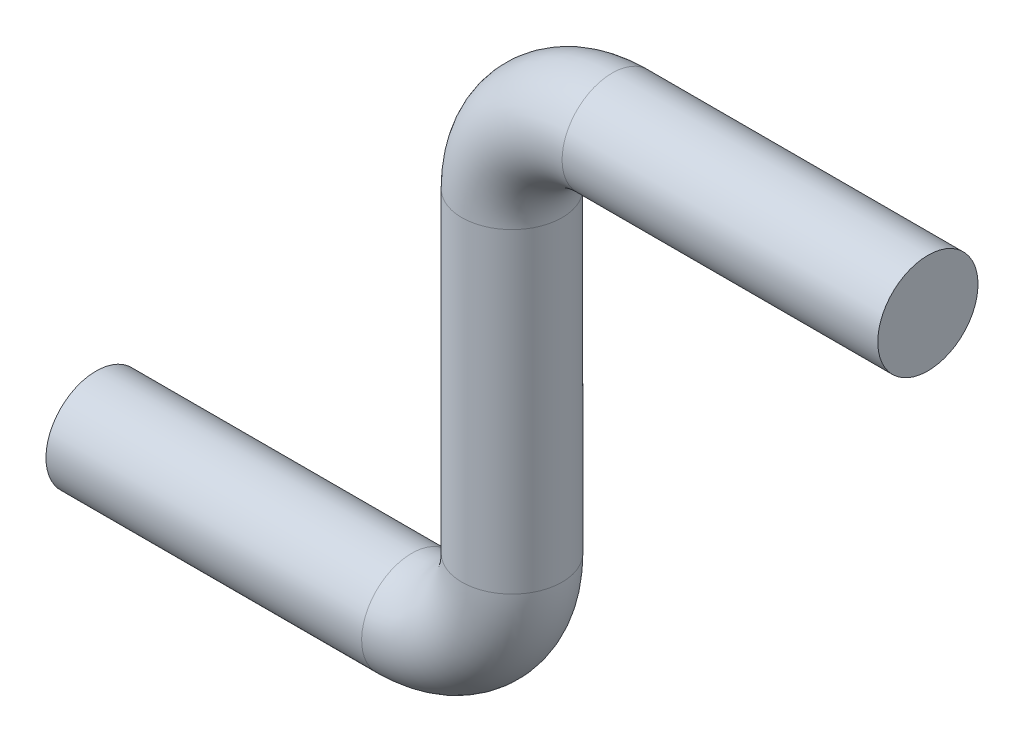
ISO-10303-21;
HEADER;
FILE_DESCRIPTION(('STEP AP214'),'2;1');
FILE_NAME('part.step','',(''),(''),'','','');
FILE_SCHEMA(('AUTOMOTIVE_DESIGN { 1 0 10303 214 1 1 1 1 }'));
ENDSEC;
DATA;
#1=APPLICATION_CONTEXT('core data for automotive mechanical design processes');
#2=APPLICATION_PROTOCOL_DEFINITION('international standard','automotive_design',2000,#1);
#3=PRODUCT_CONTEXT('',#1,'mechanical');
#4=PRODUCT('Part','Part','',(#3));
#5=PRODUCT_RELATED_PRODUCT_CATEGORY('part','',(#4));
#6=PRODUCT_DEFINITION_FORMATION('','',#4);
#7=PRODUCT_DEFINITION_CONTEXT('part definition',#1,'design');
#8=PRODUCT_DEFINITION('design','',#6,#7);
#9=PRODUCT_DEFINITION_SHAPE('','',#8);
#10=(LENGTH_UNIT() NAMED_UNIT(*) SI_UNIT(.MILLI.,.METRE.));
#11=(NAMED_UNIT(*) PLANE_ANGLE_UNIT() SI_UNIT($,.RADIAN.));
#12=(NAMED_UNIT(*) SI_UNIT($,.STERADIAN.) SOLID_ANGLE_UNIT());
#13=UNCERTAINTY_MEASURE_WITH_UNIT(LENGTH_MEASURE(1.E-05),#10,'distance_accuracy_value','');
#14=(GEOMETRIC_REPRESENTATION_CONTEXT(3) GLOBAL_UNCERTAINTY_ASSIGNED_CONTEXT((#13)) GLOBAL_UNIT_ASSIGNED_CONTEXT((#10,
#11,#12)) REPRESENTATION_CONTEXT('',''));
#15=CARTESIAN_POINT('',(0.,0.,0.));
#16=DIRECTION('',(0.,0.,1.));
#17=DIRECTION('',(1.,0.,0.));
#18=AXIS2_PLACEMENT_3D('',#15,#16,#17);
#19=CARTESIAN_POINT('',(8.175,8.175,0.));
#20=DIRECTION('',(1.,0.,0.));
#21=DIRECTION('',(0.,1.,0.));
#22=AXIS2_PLACEMENT_3D('',#19,#20,#21);
#23=CYLINDRICAL_SURFACE('',#22,0.79375);
#24=CARTESIAN_POINT('',(8.175,8.175,0.));
#25=DIRECTION('',(1.,0.,0.));
#26=DIRECTION('',(0.,0.,-1.));
#27=AXIS2_PLACEMENT_3D('',#24,#25,#26);
#28=CIRCLE('',#27,0.79375);
#29=CARTESIAN_POINT('',(8.175,8.96875,0.));
#30=VERTEX_POINT('',#29);
#31=EDGE_CURVE('E38',#30,#30,#28,.T.);
#32=ORIENTED_EDGE('',*,*,#31,.T.);
#33=EDGE_LOOP('',(#32));
#34=FACE_BOUND('',#33,.T.);
#35=CARTESIAN_POINT('',(13.175,8.175,0.));
#36=DIRECTION('',(1.,0.,0.));
#37=DIRECTION('',(0.,0.,-1.));
#38=AXIS2_PLACEMENT_3D('',#35,#36,#37);
#39=CIRCLE('',#38,0.79375);
#40=CARTESIAN_POINT('',(13.175,8.175,-0.79375));
#41=VERTEX_POINT('',#40);
#42=EDGE_CURVE('E10',#41,#41,#39,.T.);
#43=ORIENTED_EDGE('',*,*,#42,.F.);
#44=EDGE_LOOP('',(#43));
#45=FACE_BOUND('',#44,.T.);
#46=ADVANCED_FACE('F32',(#34,#45),#23,.T.);
#47=CARTESIAN_POINT('',(8.175,6.5875,0.));
#48=DIRECTION('',(0.,0.,-1.));
#49=DIRECTION('',(-1.,0.,0.));
#50=AXIS2_PLACEMENT_3D('',#47,#48,#49);
#51=TOROIDAL_SURFACE('',#50,1.5875,0.79375);
#52=CARTESIAN_POINT('',(6.5875,6.5875,0.));
#53=DIRECTION('',(0.,1.,0.));
#54=DIRECTION('',(0.,0.,-1.));
#55=AXIS2_PLACEMENT_3D('',#52,#53,#54);
#56=CIRCLE('',#55,0.79375);
#57=CARTESIAN_POINT('',(5.79375,6.5875,0.));
#58=VERTEX_POINT('',#57);
#59=EDGE_CURVE('E42',#58,#58,#56,.T.);
#60=CARTESIAN_POINT('',(8.175,6.5875,0.));
#61=DIRECTION('',(0.,0.,-1.));
#62=DIRECTION('',(-1.,0.,0.));
#63=AXIS2_PLACEMENT_3D('',#60,#61,#62);
#64=CIRCLE('',#63,2.38125);
#65=EDGE_CURVE('',#58,#30,#64,.T.);
#66=ORIENTED_EDGE('',*,*,#59,.T.);
#67=ORIENTED_EDGE('',*,*,#31,.F.);
#68=ORIENTED_EDGE('',*,*,#65,.T.);
#69=ORIENTED_EDGE('',*,*,#65,.F.);
#70=EDGE_LOOP('',(#66,#68,#67,#69));
#71=FACE_BOUND('',#70,.T.);
#72=ADVANCED_FACE('F76',(#71),#51,.T.);
#73=CARTESIAN_POINT('',(6.5875,1.5875,0.));
#74=DIRECTION('',(0.,1.,0.));
#75=DIRECTION('',(0.,0.,1.));
#76=AXIS2_PLACEMENT_3D('',#73,#74,#75);
#77=CYLINDRICAL_SURFACE('',#76,0.79375);
#78=CARTESIAN_POINT('',(6.5875,1.5875,0.));
#79=DIRECTION('',(0.,1.,0.));
#80=DIRECTION('',(0.,0.,-1.));
#81=AXIS2_PLACEMENT_3D('',#78,#79,#80);
#82=CIRCLE('',#81,0.79375);
#83=CARTESIAN_POINT('',(7.38125,1.5875,0.));
#84=VERTEX_POINT('',#83);
#85=EDGE_CURVE('E46',#84,#84,#82,.T.);
#86=ORIENTED_EDGE('',*,*,#85,.T.);
#87=EDGE_LOOP('',(#86));
#88=FACE_BOUND('',#87,.T.);
#89=ORIENTED_EDGE('',*,*,#59,.F.);
#90=EDGE_LOOP('',(#89));
#91=FACE_BOUND('',#90,.T.);
#92=ADVANCED_FACE('F80',(#88,#91),#77,.T.);
#93=CARTESIAN_POINT('',(5.,1.5875,0.));
#94=DIRECTION('',(0.,0.,1.));
#95=DIRECTION('',(1.,0.,0.));
#96=AXIS2_PLACEMENT_3D('',#93,#94,#95);
#97=TOROIDAL_SURFACE('',#96,1.5875,0.79375);
#98=CARTESIAN_POINT('',(5.,0.,0.));
#99=DIRECTION('',(1.,0.,0.));
#100=DIRECTION('',(0.,0.,-1.));
#101=AXIS2_PLACEMENT_3D('',#98,#99,#100);
#102=CIRCLE('',#101,0.79375);
#103=CARTESIAN_POINT('',(5.,-0.79375,0.));
#104=VERTEX_POINT('',#103);
#105=EDGE_CURVE('E51',#104,#104,#102,.T.);
#106=CARTESIAN_POINT('',(5.,1.5875,0.));
#107=DIRECTION('',(0.,0.,1.));
#108=DIRECTION('',(1.,0.,0.));
#109=AXIS2_PLACEMENT_3D('',#106,#107,#108);
#110=CIRCLE('',#109,2.38125);
#111=EDGE_CURVE('',#104,#84,#110,.T.);
#112=ORIENTED_EDGE('',*,*,#105,.T.);
#113=ORIENTED_EDGE('',*,*,#85,.F.);
#114=ORIENTED_EDGE('',*,*,#111,.T.);
#115=ORIENTED_EDGE('',*,*,#111,.F.);
#116=EDGE_LOOP('',(#112,#114,#113,#115));
#117=FACE_BOUND('',#116,.T.);
#118=ADVANCED_FACE('F58',(#117),#97,.T.);
#119=CARTESIAN_POINT('',(5.,0.,0.));
#120=DIRECTION('',(-1.,0.,0.));
#121=DIRECTION('',(0.,0.,1.));
#122=AXIS2_PLACEMENT_3D('',#119,#120,#121);
#123=CYLINDRICAL_SURFACE('',#122,0.79375);
#124=ORIENTED_EDGE('',*,*,#105,.F.);
#125=EDGE_LOOP('',(#124));
#126=FACE_BOUND('',#125,.T.);
#127=CARTESIAN_POINT('',(0.,0.,0.));
#128=DIRECTION('',(1.,0.,0.));
#129=DIRECTION('',(0.,0.,-1.));
#130=AXIS2_PLACEMENT_3D('',#127,#128,#129);
#131=CIRCLE('',#130,0.79375);
#132=CARTESIAN_POINT('',(0.,0.,-0.79375));
#133=VERTEX_POINT('',#132);
#134=EDGE_CURVE('E52',#133,#133,#131,.T.);
#135=ORIENTED_EDGE('',*,*,#134,.T.);
#136=EDGE_LOOP('',(#135));
#137=FACE_BOUND('',#136,.T.);
#138=ADVANCED_FACE('F61',(#126,#137),#123,.T.);
#139=CARTESIAN_POINT('',(13.175,8.175,0.));
#140=DIRECTION('',(1.,0.,0.));
#141=DIRECTION('',(0.,0.,-1.));
#142=AXIS2_PLACEMENT_3D('',#139,#140,#141);
#143=PLANE('',#142);
#144=ORIENTED_EDGE('',*,*,#42,.T.);
#145=EDGE_LOOP('',(#144));
#146=FACE_BOUND('',#145,.T.);
#147=ADVANCED_FACE('F64',(#146),#143,.T.);
#148=CARTESIAN_POINT('',(0.,0.,0.));
#149=DIRECTION('',(1.,0.,0.));
#150=DIRECTION('',(0.,0.,-1.));
#151=AXIS2_PLACEMENT_3D('',#148,#149,#150);
#152=PLANE('',#151);
#153=ORIENTED_EDGE('',*,*,#134,.F.);
#154=EDGE_LOOP('',(#153));
#155=FACE_BOUND('',#154,.T.);
#156=ADVANCED_FACE('F68',(#155),#152,.F.);
#157=CLOSED_SHELL('',(#46,#72,#92,#118,#138,#147,#156));
#158=MANIFOLD_SOLID_BREP('B2',#157);
#159=ADVANCED_BREP_SHAPE_REPRESENTATION('',(#18,#158),#14);
#160=SHAPE_DEFINITION_REPRESENTATION(#9,#159);
ENDSEC;
END-ISO-10303-21;
